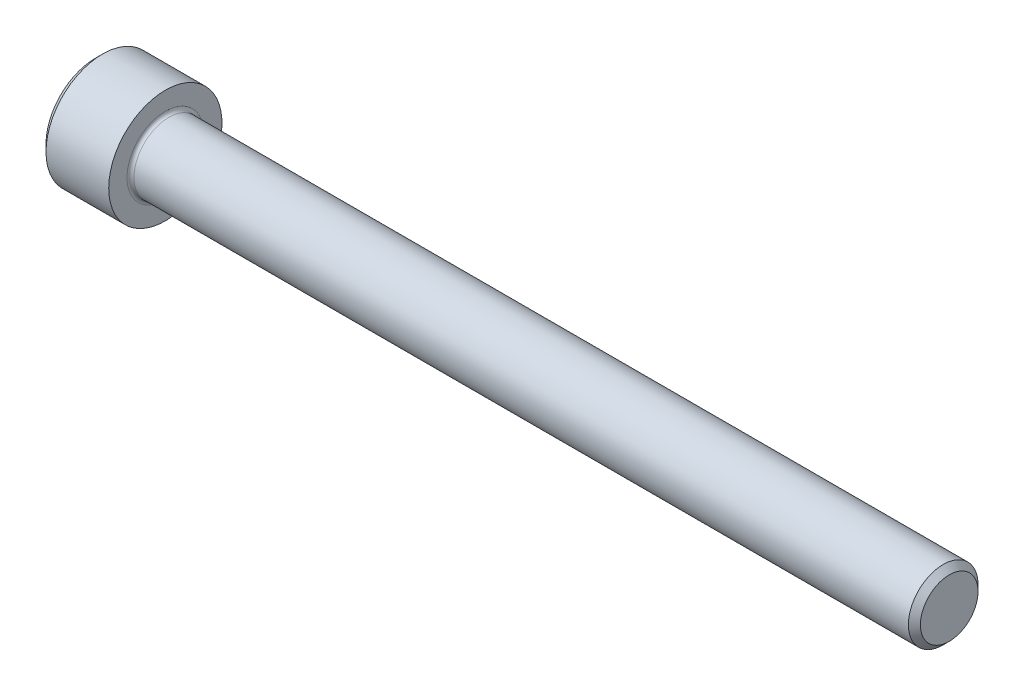
ISO-10303-21;
HEADER;
FILE_DESCRIPTION(('STEP AP214'),'2;1');
FILE_NAME('part.step','',(''),(''),'','','');
FILE_SCHEMA(('AUTOMOTIVE_DESIGN { 1 0 10303 214 1 1 1 1 }'));
ENDSEC;
DATA;
#1=APPLICATION_CONTEXT('core data for automotive mechanical design processes');
#2=APPLICATION_PROTOCOL_DEFINITION('international standard','automotive_design',2000,#1);
#3=PRODUCT_CONTEXT('',#1,'mechanical');
#4=PRODUCT('Part','Part','',(#3));
#5=PRODUCT_RELATED_PRODUCT_CATEGORY('part','',(#4));
#6=PRODUCT_DEFINITION_FORMATION('','',#4);
#7=PRODUCT_DEFINITION_CONTEXT('part definition',#1,'design');
#8=PRODUCT_DEFINITION('design','',#6,#7);
#9=PRODUCT_DEFINITION_SHAPE('','',#8);
#10=(LENGTH_UNIT() NAMED_UNIT(*) SI_UNIT(.MILLI.,.METRE.));
#11=(NAMED_UNIT(*) PLANE_ANGLE_UNIT() SI_UNIT($,.RADIAN.));
#12=(NAMED_UNIT(*) SI_UNIT($,.STERADIAN.) SOLID_ANGLE_UNIT());
#13=UNCERTAINTY_MEASURE_WITH_UNIT(LENGTH_MEASURE(1.E-05),#10,'distance_accuracy_value','');
#14=(GEOMETRIC_REPRESENTATION_CONTEXT(3) GLOBAL_UNCERTAINTY_ASSIGNED_CONTEXT((#13)) GLOBAL_UNIT_ASSIGNED_CONTEXT((#10,
#11,#12)) REPRESENTATION_CONTEXT('',''));
#15=CARTESIAN_POINT('',(0.,0.,0.));
#16=DIRECTION('',(0.,0.,1.));
#17=DIRECTION('',(1.,0.,0.));
#18=AXIS2_PLACEMENT_3D('',#15,#16,#17);
#19=CARTESIAN_POINT('',(0.,0.,0.));
#20=DIRECTION('',(-1.,0.,0.));
#21=DIRECTION('',(0.,0.,1.));
#22=AXIS2_PLACEMENT_3D('',#19,#20,#21);
#23=PLANE('',#22);
#24=DIRECTION('',(0.,-0.499999999999999,0.866025403784439));
#25=VECTOR('',#24,1.);
#26=CARTESIAN_POINT('',(0.,3.51894989071077,0.));
#27=LINE('',#26,#25);
#28=CARTESIAN_POINT('',(0.,3.51894989071077,0.));
#29=VERTEX_POINT('',#28);
#30=CARTESIAN_POINT('',(0.,1.75947494535539,3.0475));
#31=VERTEX_POINT('',#30);
#32=EDGE_CURVE('E270',#29,#31,#27,.T.);
#33=ORIENTED_EDGE('',*,*,#32,.T.);
#34=DIRECTION('',(0.,1.,0.));
#35=VECTOR('',#34,1.);
#36=CARTESIAN_POINT('',(0.,-1.75947494535538,3.0475));
#37=LINE('',#36,#35);
#38=CARTESIAN_POINT('',(0.,-1.75947494535538,3.0475));
#39=VERTEX_POINT('',#38);
#40=EDGE_CURVE('E130',#39,#31,#37,.T.);
#41=ORIENTED_EDGE('',*,*,#40,.F.);
#42=DIRECTION('',(0.,-0.500000000000001,-0.866025403784438));
#43=VECTOR('',#42,1.);
#44=CARTESIAN_POINT('',(0.,-1.75947494535538,3.0475));
#45=LINE('',#44,#43);
#46=CARTESIAN_POINT('',(0.,-3.51894989071077,0.));
#47=VERTEX_POINT('',#46);
#48=EDGE_CURVE('E273',#39,#47,#45,.T.);
#49=ORIENTED_EDGE('',*,*,#48,.T.);
#50=DIRECTION('',(0.,0.499999999999999,-0.866025403784439));
#51=VECTOR('',#50,1.);
#52=CARTESIAN_POINT('',(0.,-3.51894989071077,0.));
#53=LINE('',#52,#51);
#54=CARTESIAN_POINT('',(0.,-1.75947494535539,-3.0475));
#55=VERTEX_POINT('',#54);
#56=EDGE_CURVE('E276',#47,#55,#53,.T.);
#57=ORIENTED_EDGE('',*,*,#56,.T.);
#58=DIRECTION('',(0.,-1.,0.));
#59=VECTOR('',#58,1.);
#60=CARTESIAN_POINT('',(0.,1.75947494535538,-3.0475));
#61=LINE('',#60,#59);
#62=CARTESIAN_POINT('',(0.,1.75947494535538,-3.0475));
#63=VERTEX_POINT('',#62);
#64=EDGE_CURVE('E279',#63,#55,#61,.T.);
#65=ORIENTED_EDGE('',*,*,#64,.F.);
#66=DIRECTION('',(0.,-0.500000000000001,-0.866025403784438));
#67=VECTOR('',#66,1.);
#68=CARTESIAN_POINT('',(0.,3.51894989071077,0.));
#69=LINE('',#68,#67);
#70=EDGE_CURVE('E125',#29,#63,#69,.T.);
#71=ORIENTED_EDGE('',*,*,#70,.F.);
#72=EDGE_LOOP('',(#33,#41,#49,#57,#65,#71));
#73=FACE_BOUND('',#72,.T.);
#74=CARTESIAN_POINT('',(0.,0.,0.));
#75=DIRECTION('',(-1.,0.,0.));
#76=DIRECTION('',(0.,0.,1.));
#77=AXIS2_PLACEMENT_3D('',#74,#75,#76);
#78=CIRCLE('',#77,5.7);
#79=CARTESIAN_POINT('',(0.,0.,5.7));
#80=VERTEX_POINT('',#79);
#81=EDGE_CURVE('E154',#80,#80,#78,.T.);
#82=ORIENTED_EDGE('',*,*,#81,.T.);
#83=EDGE_LOOP('',(#82));
#84=FACE_BOUND('',#83,.T.);
#85=ADVANCED_FACE('F38',(#73,#84),#23,.T.);
#86=CARTESIAN_POINT('',(0.,0.,0.));
#87=DIRECTION('',(1.,0.,0.));
#88=DIRECTION('',(0.,0.,-1.));
#89=AXIS2_PLACEMENT_3D('',#86,#87,#88);
#90=CONICAL_SURFACE('',#89,5.7,0.785398163397447);
#91=CARTESIAN_POINT('',(0.800000000000002,0.,0.));
#92=DIRECTION('',(-1.,0.,0.));
#93=DIRECTION('',(0.,0.,1.));
#94=AXIS2_PLACEMENT_3D('',#91,#92,#93);
#95=CIRCLE('',#94,6.5);
#96=CARTESIAN_POINT('',(0.800000000000002,0.,6.5));
#97=VERTEX_POINT('',#96);
#98=EDGE_CURVE('E151',#97,#97,#95,.T.);
#99=ORIENTED_EDGE('',*,*,#98,.T.);
#100=EDGE_LOOP('',(#99));
#101=FACE_BOUND('',#100,.T.);
#102=ORIENTED_EDGE('',*,*,#81,.F.);
#103=EDGE_LOOP('',(#102));
#104=FACE_BOUND('',#103,.T.);
#105=ADVANCED_FACE('F175',(#101,#104),#90,.T.);
#106=CARTESIAN_POINT('',(-31.75,0.,0.));
#107=DIRECTION('',(-1.,0.,0.));
#108=DIRECTION('',(0.,0.,1.));
#109=AXIS2_PLACEMENT_3D('',#106,#107,#108);
#110=CYLINDRICAL_SURFACE('',#109,6.5);
#111=CARTESIAN_POINT('',(8.00000000000001,0.,0.));
#112=DIRECTION('',(-1.,0.,0.));
#113=DIRECTION('',(0.,0.,1.));
#114=AXIS2_PLACEMENT_3D('',#111,#112,#113);
#115=CIRCLE('',#114,6.5);
#116=CARTESIAN_POINT('',(8.00000000000001,0.,6.5));
#117=VERTEX_POINT('',#116);
#118=EDGE_CURVE('E148',#117,#117,#115,.T.);
#119=ORIENTED_EDGE('',*,*,#118,.T.);
#120=EDGE_LOOP('',(#119));
#121=FACE_BOUND('',#120,.T.);
#122=ORIENTED_EDGE('',*,*,#98,.F.);
#123=EDGE_LOOP('',(#122));
#124=FACE_BOUND('',#123,.T.);
#125=ADVANCED_FACE('F180',(#121,#124),#110,.T.);
#126=CARTESIAN_POINT('',(8.,6.5,0.));
#127=DIRECTION('',(1.,0.,0.));
#128=DIRECTION('',(0.,0.,-1.));
#129=AXIS2_PLACEMENT_3D('',#126,#127,#128);
#130=PLANE('',#129);
#131=CARTESIAN_POINT('',(8.,0.,0.));
#132=DIRECTION('',(1.,0.,0.));
#133=DIRECTION('',(0.,0.,-1.));
#134=AXIS2_PLACEMENT_3D('',#131,#132,#133);
#135=CIRCLE('',#134,4.39999999999961);
#136=CARTESIAN_POINT('',(8.,0.,-4.39999999999961));
#137=VERTEX_POINT('',#136);
#138=EDGE_CURVE('E46',#137,#137,#135,.F.);
#139=ORIENTED_EDGE('',*,*,#138,.T.);
#140=EDGE_LOOP('',(#139));
#141=FACE_BOUND('',#140,.T.);
#142=ORIENTED_EDGE('',*,*,#118,.F.);
#143=EDGE_LOOP('',(#142));
#144=FACE_BOUND('',#143,.T.);
#145=ADVANCED_FACE('F159',(#141,#144),#130,.T.);
#146=CARTESIAN_POINT('',(-31.75,0.,0.));
#147=DIRECTION('',(-1.,0.,0.));
#148=DIRECTION('',(0.,0.,1.));
#149=AXIS2_PLACEMENT_3D('',#146,#147,#148);
#150=CYLINDRICAL_SURFACE('',#149,3.99999999999961);
#151=CARTESIAN_POINT('',(8.4,0.,0.));
#152=DIRECTION('',(1.,0.,0.));
#153=DIRECTION('',(0.,0.,-1.));
#154=AXIS2_PLACEMENT_3D('',#151,#152,#153);
#155=CIRCLE('',#154,3.99999999999961);
#156=CARTESIAN_POINT('',(8.4,0.,-3.99999999999961));
#157=VERTEX_POINT('',#156);
#158=EDGE_CURVE('E11',#157,#157,#155,.T.);
#159=ORIENTED_EDGE('',*,*,#158,.T.);
#160=EDGE_LOOP('',(#159));
#161=FACE_BOUND('',#160,.T.);
#162=CARTESIAN_POINT('',(97.3094999999993,0.,0.));
#163=DIRECTION('',(-1.,0.,0.));
#164=DIRECTION('',(0.,0.,1.));
#165=AXIS2_PLACEMENT_3D('',#162,#163,#164);
#166=CIRCLE('',#165,3.99999999999922);
#167=CARTESIAN_POINT('',(97.3094999999993,0.,3.99999999999922));
#168=VERTEX_POINT('',#167);
#169=EDGE_CURVE('E145',#168,#168,#166,.T.);
#170=ORIENTED_EDGE('',*,*,#169,.T.);
#171=EDGE_LOOP('',(#170));
#172=FACE_BOUND('',#171,.T.);
#173=ADVANCED_FACE('F190',(#161,#172),#150,.T.);
#174=CARTESIAN_POINT('',(98.,0.,0.));
#175=DIRECTION('',(-1.,0.,0.));
#176=DIRECTION('',(0.,0.,1.));
#177=AXIS2_PLACEMENT_3D('',#174,#175,#176);
#178=CONICAL_SURFACE('',#177,3.3095,0.785398163396332);
#179=ORIENTED_EDGE('',*,*,#169,.F.);
#180=EDGE_LOOP('',(#179));
#181=FACE_BOUND('',#180,.T.);
#182=CARTESIAN_POINT('',(98.,0.,0.));
#183=DIRECTION('',(-1.,0.,0.));
#184=DIRECTION('',(0.,0.,1.));
#185=AXIS2_PLACEMENT_3D('',#182,#183,#184);
#186=CIRCLE('',#185,3.3095);
#187=CARTESIAN_POINT('',(98.,0.,3.3095));
#188=VERTEX_POINT('',#187);
#189=EDGE_CURVE('E141',#188,#188,#186,.T.);
#190=ORIENTED_EDGE('',*,*,#189,.T.);
#191=EDGE_LOOP('',(#190));
#192=FACE_BOUND('',#191,.T.);
#193=ADVANCED_FACE('F170',(#181,#192),#178,.T.);
#194=CARTESIAN_POINT('',(98.,3.3095,0.));
#195=DIRECTION('',(1.,0.,0.));
#196=DIRECTION('',(0.,0.,-1.));
#197=AXIS2_PLACEMENT_3D('',#194,#195,#196);
#198=PLANE('',#197);
#199=ORIENTED_EDGE('',*,*,#189,.F.);
#200=EDGE_LOOP('',(#199));
#201=FACE_BOUND('',#200,.T.);
#202=ADVANCED_FACE('F163',(#201),#198,.T.);
#203=CARTESIAN_POINT('',(8.4,0.,0.));
#204=DIRECTION('',(1.,0.,0.));
#205=DIRECTION('',(0.,0.,-1.));
#206=AXIS2_PLACEMENT_3D('',#203,#204,#205);
#207=TOROIDAL_SURFACE('',#206,4.39999999999961,0.4);
#208=ORIENTED_EDGE('',*,*,#158,.F.);
#209=EDGE_LOOP('',(#208));
#210=FACE_BOUND('',#209,.T.);
#211=ORIENTED_EDGE('',*,*,#138,.F.);
#212=EDGE_LOOP('',(#211));
#213=FACE_BOUND('',#212,.T.);
#214=ADVANCED_FACE('F40',(#210,#213),#207,.F.);
#215=CARTESIAN_POINT('',(4.,3.51894989071077,0.));
#216=DIRECTION('',(0.,-0.866025403784439,-0.499999999999999));
#217=DIRECTION('',(0.,0.499999999999999,-0.866025403784439));
#218=AXIS2_PLACEMENT_3D('',#215,#216,#217);
#219=PLANE('',#218);
#220=ORIENTED_EDGE('',*,*,#32,.F.);
#221=DIRECTION('',(-1.,0.,0.));
#222=VECTOR('',#221,1.);
#223=CARTESIAN_POINT('',(4.,3.51894989071077,0.));
#224=LINE('',#223,#222);
#225=CARTESIAN_POINT('',(4.,3.51894989071077,0.));
#226=VERTEX_POINT('',#225);
#227=EDGE_CURVE('E269',#226,#29,#224,.T.);
#228=ORIENTED_EDGE('',*,*,#227,.F.);
#229=DIRECTION('',(0.,-0.499999999999999,0.866025403784439));
#230=VECTOR('',#229,1.);
#231=CARTESIAN_POINT('',(4.,3.51894989071077,0.));
#232=LINE('',#231,#230);
#233=CARTESIAN_POINT('',(4.00000000000001,2.63921241803308,1.52375));
#234=VERTEX_POINT('',#233);
#235=EDGE_CURVE('E53',#226,#234,#232,.T.);
#236=ORIENTED_EDGE('',*,*,#235,.T.);
#237=CARTESIAN_POINT('',(4.,1.75947494535539,3.0475));
#238=VERTEX_POINT('',#237);
#239=EDGE_CURVE('E111',#234,#238,#232,.T.);
#240=ORIENTED_EDGE('',*,*,#239,.T.);
#241=DIRECTION('',(-1.,0.,0.));
#242=VECTOR('',#241,1.);
#243=CARTESIAN_POINT('',(4.,1.75947494535539,3.0475));
#244=LINE('',#243,#242);
#245=EDGE_CURVE('E123',#238,#31,#244,.T.);
#246=ORIENTED_EDGE('',*,*,#245,.T.);
#247=EDGE_LOOP('',(#220,#228,#236,#240,#246));
#248=FACE_BOUND('',#247,.T.);
#249=ADVANCED_FACE('F122',(#248),#219,.T.);
#250=CARTESIAN_POINT('',(4.,-1.75947494535538,3.0475));
#251=DIRECTION('',(0.,0.,1.));
#252=DIRECTION('',(0.,-1.,0.));
#253=AXIS2_PLACEMENT_3D('',#250,#251,#252);
#254=PLANE('',#253);
#255=ORIENTED_EDGE('',*,*,#40,.T.);
#256=ORIENTED_EDGE('',*,*,#245,.F.);
#257=DIRECTION('',(0.,1.,0.));
#258=VECTOR('',#257,1.);
#259=CARTESIAN_POINT('',(4.,-1.75947494535538,3.0475));
#260=LINE('',#259,#258);
#261=CARTESIAN_POINT('',(4.,0.,3.0475));
#262=VERTEX_POINT('',#261);
#263=EDGE_CURVE('E109',#262,#238,#260,.T.);
#264=ORIENTED_EDGE('',*,*,#263,.F.);
#265=CARTESIAN_POINT('',(4.,-1.75947494535538,3.0475));
#266=VERTEX_POINT('',#265);
#267=EDGE_CURVE('E119',#266,#262,#260,.T.);
#268=ORIENTED_EDGE('',*,*,#267,.F.);
#269=DIRECTION('',(-1.,0.,0.));
#270=VECTOR('',#269,1.);
#271=CARTESIAN_POINT('',(4.,-1.75947494535538,3.0475));
#272=LINE('',#271,#270);
#273=EDGE_CURVE('E132',#266,#39,#272,.T.);
#274=ORIENTED_EDGE('',*,*,#273,.T.);
#275=EDGE_LOOP('',(#255,#256,#264,#268,#274));
#276=FACE_BOUND('',#275,.T.);
#277=ADVANCED_FACE('F127',(#276),#254,.F.);
#278=CARTESIAN_POINT('',(4.,-1.75947494535538,3.0475));
#279=DIRECTION('',(0.,0.866025403784438,-0.500000000000001));
#280=DIRECTION('',(0.,0.500000000000001,0.866025403784438));
#281=AXIS2_PLACEMENT_3D('',#278,#279,#280);
#282=PLANE('',#281);
#283=ORIENTED_EDGE('',*,*,#48,.F.);
#284=ORIENTED_EDGE('',*,*,#273,.F.);
#285=DIRECTION('',(0.,-0.500000000000001,-0.866025403784438));
#286=VECTOR('',#285,1.);
#287=CARTESIAN_POINT('',(4.,-1.75947494535538,3.0475));
#288=LINE('',#287,#286);
#289=CARTESIAN_POINT('',(4.,-2.63921241803308,1.52375));
#290=VERTEX_POINT('',#289);
#291=EDGE_CURVE('E250',#266,#290,#288,.T.);
#292=ORIENTED_EDGE('',*,*,#291,.T.);
#293=CARTESIAN_POINT('',(4.,-3.51894989071077,0.));
#294=VERTEX_POINT('',#293);
#295=EDGE_CURVE('E252',#290,#294,#288,.T.);
#296=ORIENTED_EDGE('',*,*,#295,.T.);
#297=DIRECTION('',(-1.,0.,0.));
#298=VECTOR('',#297,1.);
#299=CARTESIAN_POINT('',(4.,-3.51894989071077,0.));
#300=LINE('',#299,#298);
#301=EDGE_CURVE('E137',#294,#47,#300,.T.);
#302=ORIENTED_EDGE('',*,*,#301,.T.);
#303=EDGE_LOOP('',(#283,#284,#292,#296,#302));
#304=FACE_BOUND('',#303,.T.);
#305=ADVANCED_FACE('F202',(#304),#282,.T.);
#306=CARTESIAN_POINT('',(4.,-3.51894989071077,0.));
#307=DIRECTION('',(0.,0.866025403784439,0.499999999999999));
#308=DIRECTION('',(0.,-0.499999999999999,0.866025403784439));
#309=AXIS2_PLACEMENT_3D('',#306,#307,#308);
#310=PLANE('',#309);
#311=ORIENTED_EDGE('',*,*,#56,.F.);
#312=ORIENTED_EDGE('',*,*,#301,.F.);
#313=DIRECTION('',(0.,0.499999999999999,-0.866025403784439));
#314=VECTOR('',#313,1.);
#315=CARTESIAN_POINT('',(4.,-3.51894989071077,0.));
#316=LINE('',#315,#314);
#317=CARTESIAN_POINT('',(4.,-2.63921241803308,-1.52375));
#318=VERTEX_POINT('',#317);
#319=EDGE_CURVE('E255',#294,#318,#316,.T.);
#320=ORIENTED_EDGE('',*,*,#319,.T.);
#321=CARTESIAN_POINT('',(4.,-1.75947494535539,-3.0475));
#322=VERTEX_POINT('',#321);
#323=EDGE_CURVE('E259',#318,#322,#316,.T.);
#324=ORIENTED_EDGE('',*,*,#323,.T.);
#325=DIRECTION('',(-1.,0.,0.));
#326=VECTOR('',#325,1.);
#327=CARTESIAN_POINT('',(4.,-1.75947494535539,-3.0475));
#328=LINE('',#327,#326);
#329=EDGE_CURVE('E288',#322,#55,#328,.T.);
#330=ORIENTED_EDGE('',*,*,#329,.T.);
#331=EDGE_LOOP('',(#311,#312,#320,#324,#330));
#332=FACE_BOUND('',#331,.T.);
#333=ADVANCED_FACE('F205',(#332),#310,.T.);
#334=CARTESIAN_POINT('',(4.,1.75947494535538,-3.0475));
#335=DIRECTION('',(0.,0.,-1.));
#336=DIRECTION('',(0.,1.,0.));
#337=AXIS2_PLACEMENT_3D('',#334,#335,#336);
#338=PLANE('',#337);
#339=ORIENTED_EDGE('',*,*,#64,.T.);
#340=ORIENTED_EDGE('',*,*,#329,.F.);
#341=DIRECTION('',(0.,-1.,0.));
#342=VECTOR('',#341,1.);
#343=CARTESIAN_POINT('',(4.,1.75947494535538,-3.0475));
#344=LINE('',#343,#342);
#345=CARTESIAN_POINT('',(4.,0.,-3.0475));
#346=VERTEX_POINT('',#345);
#347=EDGE_CURVE('E263',#346,#322,#344,.T.);
#348=ORIENTED_EDGE('',*,*,#347,.F.);
#349=CARTESIAN_POINT('',(4.,1.75947494535538,-3.0475));
#350=VERTEX_POINT('',#349);
#351=EDGE_CURVE('E264',#350,#346,#344,.T.);
#352=ORIENTED_EDGE('',*,*,#351,.F.);
#353=DIRECTION('',(-1.,0.,0.));
#354=VECTOR('',#353,1.);
#355=CARTESIAN_POINT('',(4.,1.75947494535538,-3.0475));
#356=LINE('',#355,#354);
#357=EDGE_CURVE('E285',#350,#63,#356,.T.);
#358=ORIENTED_EDGE('',*,*,#357,.T.);
#359=EDGE_LOOP('',(#339,#340,#348,#352,#358));
#360=FACE_BOUND('',#359,.T.);
#361=ADVANCED_FACE('F209',(#360),#338,.F.);
#362=CARTESIAN_POINT('',(4.,3.51894989071077,0.));
#363=DIRECTION('',(0.,0.866025403784438,-0.500000000000001));
#364=DIRECTION('',(0.,0.500000000000001,0.866025403784438));
#365=AXIS2_PLACEMENT_3D('',#362,#363,#364);
#366=PLANE('',#365);
#367=ORIENTED_EDGE('',*,*,#70,.T.);
#368=ORIENTED_EDGE('',*,*,#357,.F.);
#369=DIRECTION('',(0.,-0.500000000000001,-0.866025403784438));
#370=VECTOR('',#369,1.);
#371=CARTESIAN_POINT('',(4.,3.51894989071077,0.));
#372=LINE('',#371,#370);
#373=CARTESIAN_POINT('',(4.,2.63921241803307,-1.52375));
#374=VERTEX_POINT('',#373);
#375=EDGE_CURVE('E267',#374,#350,#372,.T.);
#376=ORIENTED_EDGE('',*,*,#375,.F.);
#377=EDGE_CURVE('E241',#226,#374,#372,.T.);
#378=ORIENTED_EDGE('',*,*,#377,.F.);
#379=ORIENTED_EDGE('',*,*,#227,.T.);
#380=EDGE_LOOP('',(#367,#368,#376,#378,#379));
#381=FACE_BOUND('',#380,.T.);
#382=ADVANCED_FACE('F213',(#381),#366,.F.);
#383=CARTESIAN_POINT('',(4.,1.75947494535538,3.0475));
#384=DIRECTION('',(-1.,0.,0.));
#385=DIRECTION('',(0.,0.,1.));
#386=AXIS2_PLACEMENT_3D('',#383,#384,#385);
#387=PLANE('',#386);
#388=CARTESIAN_POINT('',(4.00000000000001,0.,0.));
#389=DIRECTION('',(-1.,0.,0.));
#390=DIRECTION('',(0.,0.,1.));
#391=AXIS2_PLACEMENT_3D('',#388,#389,#390);
#392=CIRCLE('',#391,3.0475);
#393=EDGE_CURVE('E131',#290,#262,#392,.T.);
#394=ORIENTED_EDGE('',*,*,#393,.F.);
#395=ORIENTED_EDGE('',*,*,#291,.F.);
#396=ORIENTED_EDGE('',*,*,#267,.T.);
#397=EDGE_LOOP('',(#394,#395,#396));
#398=FACE_BOUND('',#397,.T.);
#399=ADVANCED_FACE('F217',(#398),#387,.T.);
#400=EDGE_CURVE('E135',#318,#290,#392,.T.);
#401=ORIENTED_EDGE('',*,*,#400,.F.);
#402=ORIENTED_EDGE('',*,*,#319,.F.);
#403=ORIENTED_EDGE('',*,*,#295,.F.);
#404=EDGE_LOOP('',(#401,#402,#403));
#405=FACE_BOUND('',#404,.T.);
#406=ADVANCED_FACE('F220',(#405),#387,.T.);
#407=EDGE_CURVE('E294',#346,#318,#392,.T.);
#408=ORIENTED_EDGE('',*,*,#407,.F.);
#409=ORIENTED_EDGE('',*,*,#347,.T.);
#410=ORIENTED_EDGE('',*,*,#323,.F.);
#411=EDGE_LOOP('',(#408,#409,#410));
#412=FACE_BOUND('',#411,.T.);
#413=ADVANCED_FACE('F225',(#412),#387,.T.);
#414=EDGE_CURVE('E244',#374,#346,#392,.T.);
#415=ORIENTED_EDGE('',*,*,#414,.F.);
#416=ORIENTED_EDGE('',*,*,#375,.T.);
#417=ORIENTED_EDGE('',*,*,#351,.T.);
#418=EDGE_LOOP('',(#415,#416,#417));
#419=FACE_BOUND('',#418,.T.);
#420=ADVANCED_FACE('F232',(#419),#387,.T.);
#421=EDGE_CURVE('E142',#234,#374,#392,.T.);
#422=ORIENTED_EDGE('',*,*,#421,.F.);
#423=ORIENTED_EDGE('',*,*,#235,.F.);
#424=ORIENTED_EDGE('',*,*,#377,.T.);
#425=EDGE_LOOP('',(#422,#423,#424));
#426=FACE_BOUND('',#425,.T.);
#427=ADVANCED_FACE('F228',(#426),#387,.T.);
#428=EDGE_CURVE('E114',#262,#234,#392,.T.);
#429=ORIENTED_EDGE('',*,*,#428,.F.);
#430=ORIENTED_EDGE('',*,*,#263,.T.);
#431=ORIENTED_EDGE('',*,*,#239,.F.);
#432=EDGE_LOOP('',(#429,#430,#431));
#433=FACE_BOUND('',#432,.T.);
#434=ADVANCED_FACE('F110',(#433),#387,.T.);
#435=CARTESIAN_POINT('',(4.00000000000001,0.,0.));
#436=DIRECTION('',(-1.,0.,0.));
#437=DIRECTION('',(0.,0.,1.));
#438=AXIS2_PLACEMENT_3D('',#435,#436,#437);
#439=CONICAL_SURFACE('',#438,3.0475,1.04719755119659);
#440=CARTESIAN_POINT('',(5.75947494535541,0.,0.));
#441=VERTEX_POINT('',#440);
#442=VERTEX_LOOP('',#441);
#443=FACE_BOUND('',#442,.T.);
#444=ORIENTED_EDGE('',*,*,#428,.T.);
#445=ORIENTED_EDGE('',*,*,#421,.T.);
#446=ORIENTED_EDGE('',*,*,#414,.T.);
#447=ORIENTED_EDGE('',*,*,#407,.T.);
#448=ORIENTED_EDGE('',*,*,#400,.T.);
#449=ORIENTED_EDGE('',*,*,#393,.T.);
#450=EDGE_LOOP('',(#444,#445,#446,#447,#448,#449));
#451=FACE_BOUND('',#450,.T.);
#452=ADVANCED_FACE('F197',(#443,#451),#439,.F.);
#453=CLOSED_SHELL('',(#85,#105,#125,#145,#173,#193,#202,#214,#249,#277,#305,#333,#361,#382,#399,
#406,#413,#420,#427,#434,#452));
#454=MANIFOLD_SOLID_BREP('B2',#453);
#455=ADVANCED_BREP_SHAPE_REPRESENTATION('',(#18,#454),#14);
#456=SHAPE_DEFINITION_REPRESENTATION(#9,#455);
ENDSEC;
END-ISO-10303-21;
